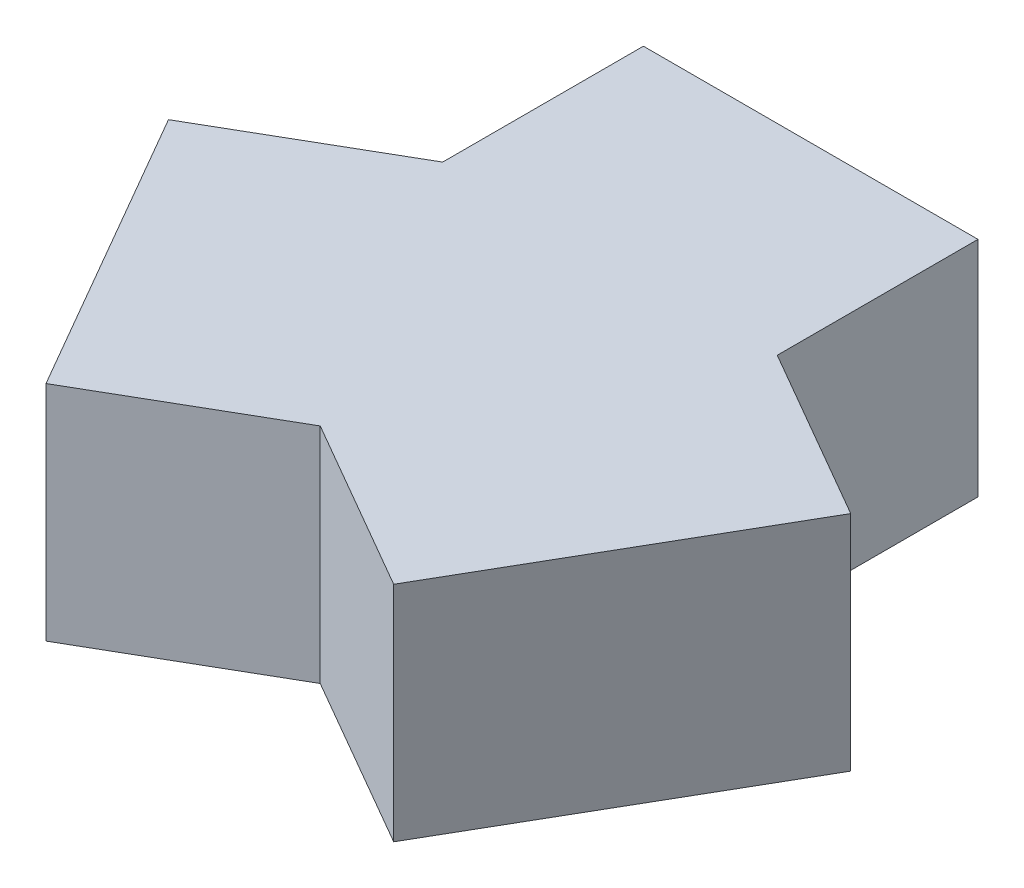
ISO-10303-21;
HEADER;
FILE_DESCRIPTION(('STEP AP214'),'2;1');
FILE_NAME('part.step','',(''),(''),'','','');
FILE_SCHEMA(('AUTOMOTIVE_DESIGN { 1 0 10303 214 1 1 1 1 }'));
ENDSEC;
DATA;
#1=APPLICATION_CONTEXT('core data for automotive mechanical design processes');
#2=APPLICATION_PROTOCOL_DEFINITION('international standard','automotive_design',2000,#1);
#3=PRODUCT_CONTEXT('',#1,'mechanical');
#4=PRODUCT('Part','Part','',(#3));
#5=PRODUCT_RELATED_PRODUCT_CATEGORY('part','',(#4));
#6=PRODUCT_DEFINITION_FORMATION('','',#4);
#7=PRODUCT_DEFINITION_CONTEXT('part definition',#1,'design');
#8=PRODUCT_DEFINITION('design','',#6,#7);
#9=PRODUCT_DEFINITION_SHAPE('','',#8);
#10=(LENGTH_UNIT() NAMED_UNIT(*) SI_UNIT(.MILLI.,.METRE.));
#11=(NAMED_UNIT(*) PLANE_ANGLE_UNIT() SI_UNIT($,.RADIAN.));
#12=(NAMED_UNIT(*) SI_UNIT($,.STERADIAN.) SOLID_ANGLE_UNIT());
#13=UNCERTAINTY_MEASURE_WITH_UNIT(LENGTH_MEASURE(1.E-05),#10,'distance_accuracy_value','');
#14=(GEOMETRIC_REPRESENTATION_CONTEXT(3) GLOBAL_UNCERTAINTY_ASSIGNED_CONTEXT((#13)) GLOBAL_UNIT_ASSIGNED_CONTEXT((#10,
#11,#12)) REPRESENTATION_CONTEXT('',''));
#15=CARTESIAN_POINT('',(0.,0.,0.));
#16=DIRECTION('',(0.,0.,1.));
#17=DIRECTION('',(1.,0.,0.));
#18=AXIS2_PLACEMENT_3D('',#15,#16,#17);
#19=CARTESIAN_POINT('',(7.50000000000006,5.,-5.));
#20=DIRECTION('',(-1.,0.,0.));
#21=DIRECTION('',(0.,0.,1.));
#22=AXIS2_PLACEMENT_3D('',#19,#20,#21);
#23=PLANE('',#22);
#24=DIRECTION('',(0.,0.,-1.));
#25=VECTOR('',#24,1.);
#26=CARTESIAN_POINT('',(7.50000000000006,-5.,-5.));
#27=LINE('',#26,#25);
#28=CARTESIAN_POINT('',(7.50000000000006,-5.,-5.));
#29=VERTEX_POINT('',#28);
#30=CARTESIAN_POINT('',(7.50000000000006,-5.,-14.));
#31=VERTEX_POINT('',#30);
#32=EDGE_CURVE('E146',#29,#31,#27,.T.);
#33=ORIENTED_EDGE('',*,*,#32,.T.);
#34=DIRECTION('',(0.,-1.,0.));
#35=VECTOR('',#34,1.);
#36=CARTESIAN_POINT('',(7.50000000000006,5.,-14.));
#37=LINE('',#36,#35);
#38=CARTESIAN_POINT('',(7.50000000000006,5.,-14.));
#39=VERTEX_POINT('',#38);
#40=EDGE_CURVE('E11',#39,#31,#37,.T.);
#41=ORIENTED_EDGE('',*,*,#40,.F.);
#42=DIRECTION('',(0.,0.,-1.));
#43=VECTOR('',#42,1.);
#44=CARTESIAN_POINT('',(7.50000000000006,5.,-5.));
#45=LINE('',#44,#43);
#46=CARTESIAN_POINT('',(7.50000000000006,5.,-5.));
#47=VERTEX_POINT('',#46);
#48=EDGE_CURVE('E171',#47,#39,#45,.T.);
#49=ORIENTED_EDGE('',*,*,#48,.F.);
#50=DIRECTION('',(0.,-1.,0.));
#51=VECTOR('',#50,1.);
#52=CARTESIAN_POINT('',(7.50000000000006,5.,-5.));
#53=LINE('',#52,#51);
#54=EDGE_CURVE('E142',#47,#29,#53,.T.);
#55=ORIENTED_EDGE('',*,*,#54,.T.);
#56=EDGE_LOOP('',(#33,#41,#49,#55));
#57=FACE_BOUND('',#56,.T.);
#58=ADVANCED_FACE('F39',(#57),#23,.F.);
#59=CARTESIAN_POINT('',(-7.50000000000006,5.,-14.));
#60=DIRECTION('',(0.,0.,1.));
#61=DIRECTION('',(1.,0.,0.));
#62=AXIS2_PLACEMENT_3D('',#59,#60,#61);
#63=PLANE('',#62);
#64=DIRECTION('',(-1.,0.,0.));
#65=VECTOR('',#64,1.);
#66=CARTESIAN_POINT('',(-7.50000000000006,-5.,-14.));
#67=LINE('',#66,#65);
#68=CARTESIAN_POINT('',(-7.50000000000006,-5.,-14.));
#69=VERTEX_POINT('',#68);
#70=EDGE_CURVE('E150',#31,#69,#67,.T.);
#71=ORIENTED_EDGE('',*,*,#70,.T.);
#72=DIRECTION('',(0.,-1.,0.));
#73=VECTOR('',#72,1.);
#74=CARTESIAN_POINT('',(-7.50000000000006,5.,-14.));
#75=LINE('',#74,#73);
#76=CARTESIAN_POINT('',(-7.50000000000006,5.,-14.));
#77=VERTEX_POINT('',#76);
#78=EDGE_CURVE('E48',#77,#69,#75,.T.);
#79=ORIENTED_EDGE('',*,*,#78,.F.);
#80=DIRECTION('',(-1.,0.,0.));
#81=VECTOR('',#80,1.);
#82=CARTESIAN_POINT('',(-7.50000000000006,5.,-14.));
#83=LINE('',#82,#81);
#84=EDGE_CURVE('E102',#39,#77,#83,.T.);
#85=ORIENTED_EDGE('',*,*,#84,.F.);
#86=ORIENTED_EDGE('',*,*,#40,.T.);
#87=EDGE_LOOP('',(#71,#79,#85,#86));
#88=FACE_BOUND('',#87,.T.);
#89=ADVANCED_FACE('F227',(#88),#63,.F.);
#90=CARTESIAN_POINT('',(-7.50000000000006,5.,-5.));
#91=DIRECTION('',(1.,0.,0.));
#92=DIRECTION('',(0.,0.,-1.));
#93=AXIS2_PLACEMENT_3D('',#90,#91,#92);
#94=PLANE('',#93);
#95=DIRECTION('',(0.,0.,1.));
#96=VECTOR('',#95,1.);
#97=CARTESIAN_POINT('',(-7.50000000000006,-5.,-5.));
#98=LINE('',#97,#96);
#99=CARTESIAN_POINT('',(-7.50000000000006,-5.,-5.));
#100=VERTEX_POINT('',#99);
#101=EDGE_CURVE('E153',#69,#100,#98,.T.);
#102=ORIENTED_EDGE('',*,*,#101,.T.);
#103=DIRECTION('',(0.,-1.,0.));
#104=VECTOR('',#103,1.);
#105=CARTESIAN_POINT('',(-7.50000000000006,5.,-5.));
#106=LINE('',#105,#104);
#107=CARTESIAN_POINT('',(-7.50000000000006,5.,-5.));
#108=VERTEX_POINT('',#107);
#109=EDGE_CURVE('E186',#108,#100,#106,.T.);
#110=ORIENTED_EDGE('',*,*,#109,.F.);
#111=DIRECTION('',(0.,0.,1.));
#112=VECTOR('',#111,1.);
#113=CARTESIAN_POINT('',(-7.50000000000006,5.,-5.));
#114=LINE('',#113,#112);
#115=EDGE_CURVE('E196',#77,#108,#114,.T.);
#116=ORIENTED_EDGE('',*,*,#115,.F.);
#117=ORIENTED_EDGE('',*,*,#78,.T.);
#118=EDGE_LOOP('',(#102,#110,#116,#117));
#119=FACE_BOUND('',#118,.T.);
#120=ADVANCED_FACE('F194',(#119),#94,.F.);
#121=CARTESIAN_POINT('',(-15.29422863406,5.,-0.499999999999995));
#122=DIRECTION('',(0.5,0.,0.866025403784438));
#123=DIRECTION('',(0.866025403784438,0.,-0.5));
#124=AXIS2_PLACEMENT_3D('',#121,#122,#123);
#125=PLANE('',#124);
#126=DIRECTION('',(-0.866025403784438,0.,0.5));
#127=VECTOR('',#126,1.);
#128=CARTESIAN_POINT('',(-15.29422863406,-5.,-0.499999999999995));
#129=LINE('',#128,#127);
#130=CARTESIAN_POINT('',(-15.29422863406,-5.,-0.499999999999995));
#131=VERTEX_POINT('',#130);
#132=EDGE_CURVE('E156',#100,#131,#129,.T.);
#133=ORIENTED_EDGE('',*,*,#132,.T.);
#134=DIRECTION('',(0.,-1.,0.));
#135=VECTOR('',#134,1.);
#136=CARTESIAN_POINT('',(-15.29422863406,5.,-0.499999999999995));
#137=LINE('',#136,#135);
#138=CARTESIAN_POINT('',(-15.29422863406,5.,-0.499999999999995));
#139=VERTEX_POINT('',#138);
#140=EDGE_CURVE('E182',#139,#131,#137,.T.);
#141=ORIENTED_EDGE('',*,*,#140,.F.);
#142=DIRECTION('',(-0.866025403784438,0.,0.5));
#143=VECTOR('',#142,1.);
#144=CARTESIAN_POINT('',(-15.29422863406,5.,-0.499999999999995));
#145=LINE('',#144,#143);
#146=EDGE_CURVE('E213',#108,#139,#145,.T.);
#147=ORIENTED_EDGE('',*,*,#146,.F.);
#148=ORIENTED_EDGE('',*,*,#109,.T.);
#149=EDGE_LOOP('',(#133,#141,#147,#148));
#150=FACE_BOUND('',#149,.T.);
#151=ADVANCED_FACE('F205',(#150),#125,.F.);
#152=CARTESIAN_POINT('',(-15.29422863406,5.,-0.499999999999995));
#153=DIRECTION('',(0.866025403784438,0.,-0.5));
#154=DIRECTION('',(-0.5,0.,-0.866025403784439));
#155=AXIS2_PLACEMENT_3D('',#152,#153,#154);
#156=PLANE('',#155);
#157=DIRECTION('',(0.5,0.,0.866025403784438));
#158=VECTOR('',#157,1.);
#159=CARTESIAN_POINT('',(-15.29422863406,-5.,-0.499999999999995));
#160=LINE('',#159,#158);
#161=CARTESIAN_POINT('',(-7.79422863405994,-5.,12.4903810567667));
#162=VERTEX_POINT('',#161);
#163=EDGE_CURVE('E159',#131,#162,#160,.T.);
#164=ORIENTED_EDGE('',*,*,#163,.T.);
#165=DIRECTION('',(0.,-1.,0.));
#166=VECTOR('',#165,1.);
#167=CARTESIAN_POINT('',(-7.79422863405994,5.,12.4903810567667));
#168=LINE('',#167,#166);
#169=CARTESIAN_POINT('',(-7.79422863405994,5.,12.4903810567667));
#170=VERTEX_POINT('',#169);
#171=EDGE_CURVE('E178',#170,#162,#168,.T.);
#172=ORIENTED_EDGE('',*,*,#171,.F.);
#173=DIRECTION('',(0.5,0.,0.866025403784438));
#174=VECTOR('',#173,1.);
#175=CARTESIAN_POINT('',(-15.29422863406,5.,-0.499999999999995));
#176=LINE('',#175,#174);
#177=EDGE_CURVE('E211',#139,#170,#176,.T.);
#178=ORIENTED_EDGE('',*,*,#177,.F.);
#179=ORIENTED_EDGE('',*,*,#140,.T.);
#180=EDGE_LOOP('',(#164,#172,#178,#179));
#181=FACE_BOUND('',#180,.T.);
#182=ADVANCED_FACE('F209',(#181),#156,.F.);
#183=CARTESIAN_POINT('',(0.,5.,7.99038105676669));
#184=DIRECTION('',(-0.5,0.,-0.866025403784438));
#185=DIRECTION('',(-0.866025403784439,0.,0.5));
#186=AXIS2_PLACEMENT_3D('',#183,#184,#185);
#187=PLANE('',#186);
#188=DIRECTION('',(0.866025403784439,0.,-0.5));
#189=VECTOR('',#188,1.);
#190=CARTESIAN_POINT('',(0.,-5.,7.99038105676669));
#191=LINE('',#190,#189);
#192=CARTESIAN_POINT('',(0.,-5.,7.99038105676669));
#193=VERTEX_POINT('',#192);
#194=EDGE_CURVE('E162',#162,#193,#191,.T.);
#195=ORIENTED_EDGE('',*,*,#194,.T.);
#196=DIRECTION('',(0.,-1.,0.));
#197=VECTOR('',#196,1.);
#198=CARTESIAN_POINT('',(0.,5.,7.99038105676669));
#199=LINE('',#198,#197);
#200=CARTESIAN_POINT('',(0.,5.,7.99038105676669));
#201=VERTEX_POINT('',#200);
#202=EDGE_CURVE('E135',#201,#193,#199,.T.);
#203=ORIENTED_EDGE('',*,*,#202,.F.);
#204=DIRECTION('',(0.866025403784439,0.,-0.5));
#205=VECTOR('',#204,1.);
#206=CARTESIAN_POINT('',(0.,5.,7.99038105676669));
#207=LINE('',#206,#205);
#208=EDGE_CURVE('E124',#170,#201,#207,.T.);
#209=ORIENTED_EDGE('',*,*,#208,.F.);
#210=ORIENTED_EDGE('',*,*,#171,.T.);
#211=EDGE_LOOP('',(#195,#203,#209,#210));
#212=FACE_BOUND('',#211,.T.);
#213=ADVANCED_FACE('F239',(#212),#187,.F.);
#214=CARTESIAN_POINT('',(0.,5.,7.99038105676669));
#215=DIRECTION('',(0.5,0.,-0.866025403784439));
#216=DIRECTION('',(-0.866025403784439,0.,-0.5));
#217=AXIS2_PLACEMENT_3D('',#214,#215,#216);
#218=PLANE('',#217);
#219=DIRECTION('',(0.866025403784439,0.,0.499999999999999));
#220=VECTOR('',#219,1.);
#221=CARTESIAN_POINT('',(0.,-5.,7.99038105676669));
#222=LINE('',#221,#220);
#223=CARTESIAN_POINT('',(7.79422863405995,-5.,12.4903810567667));
#224=VERTEX_POINT('',#223);
#225=EDGE_CURVE('E133',#193,#224,#222,.T.);
#226=ORIENTED_EDGE('',*,*,#225,.T.);
#227=DIRECTION('',(0.,-1.,0.));
#228=VECTOR('',#227,1.);
#229=CARTESIAN_POINT('',(7.79422863405995,5.,12.4903810567667));
#230=LINE('',#229,#228);
#231=CARTESIAN_POINT('',(7.79422863405995,5.,12.4903810567667));
#232=VERTEX_POINT('',#231);
#233=EDGE_CURVE('E130',#232,#224,#230,.T.);
#234=ORIENTED_EDGE('',*,*,#233,.F.);
#235=DIRECTION('',(0.866025403784439,0.,0.499999999999999));
#236=VECTOR('',#235,1.);
#237=CARTESIAN_POINT('',(0.,5.,7.99038105676669));
#238=LINE('',#237,#236);
#239=EDGE_CURVE('E118',#201,#232,#238,.T.);
#240=ORIENTED_EDGE('',*,*,#239,.F.);
#241=ORIENTED_EDGE('',*,*,#202,.T.);
#242=EDGE_LOOP('',(#226,#234,#240,#241));
#243=FACE_BOUND('',#242,.T.);
#244=ADVANCED_FACE('F131',(#243),#218,.F.);
#245=CARTESIAN_POINT('',(15.29422863406,5.,-0.499999999999999));
#246=DIRECTION('',(-0.866025403784439,0.,-0.5));
#247=DIRECTION('',(-0.5,0.,0.866025403784439));
#248=AXIS2_PLACEMENT_3D('',#245,#246,#247);
#249=PLANE('',#248);
#250=DIRECTION('',(0.5,0.,-0.866025403784439));
#251=VECTOR('',#250,1.);
#252=CARTESIAN_POINT('',(15.29422863406,-5.,-0.499999999999999));
#253=LINE('',#252,#251);
#254=CARTESIAN_POINT('',(15.29422863406,-5.,-0.499999999999999));
#255=VERTEX_POINT('',#254);
#256=EDGE_CURVE('E88',#224,#255,#253,.T.);
#257=ORIENTED_EDGE('',*,*,#256,.T.);
#258=DIRECTION('',(0.,-1.,0.));
#259=VECTOR('',#258,1.);
#260=CARTESIAN_POINT('',(15.29422863406,5.,-0.499999999999999));
#261=LINE('',#260,#259);
#262=CARTESIAN_POINT('',(15.29422863406,5.,-0.499999999999999));
#263=VERTEX_POINT('',#262);
#264=EDGE_CURVE('E136',#263,#255,#261,.T.);
#265=ORIENTED_EDGE('',*,*,#264,.F.);
#266=DIRECTION('',(0.5,0.,-0.866025403784439));
#267=VECTOR('',#266,1.);
#268=CARTESIAN_POINT('',(15.29422863406,5.,-0.499999999999999));
#269=LINE('',#268,#267);
#270=EDGE_CURVE('E122',#232,#263,#269,.T.);
#271=ORIENTED_EDGE('',*,*,#270,.F.);
#272=ORIENTED_EDGE('',*,*,#233,.T.);
#273=EDGE_LOOP('',(#257,#265,#271,#272));
#274=FACE_BOUND('',#273,.T.);
#275=ADVANCED_FACE('F138',(#274),#249,.F.);
#276=CARTESIAN_POINT('',(15.29422863406,5.,-0.499999999999999));
#277=DIRECTION('',(-0.5,0.,0.866025403784439));
#278=DIRECTION('',(0.866025403784439,0.,0.5));
#279=AXIS2_PLACEMENT_3D('',#276,#277,#278);
#280=PLANE('',#279);
#281=DIRECTION('',(-0.866025403784439,0.,-0.5));
#282=VECTOR('',#281,1.);
#283=CARTESIAN_POINT('',(15.29422863406,-5.,-0.499999999999999));
#284=LINE('',#283,#282);
#285=EDGE_CURVE('E94',#255,#29,#284,.T.);
#286=ORIENTED_EDGE('',*,*,#285,.T.);
#287=ORIENTED_EDGE('',*,*,#54,.F.);
#288=DIRECTION('',(-0.866025403784439,0.,-0.5));
#289=VECTOR('',#288,1.);
#290=CARTESIAN_POINT('',(15.29422863406,5.,-0.499999999999999));
#291=LINE('',#290,#289);
#292=EDGE_CURVE('E56',#263,#47,#291,.T.);
#293=ORIENTED_EDGE('',*,*,#292,.F.);
#294=ORIENTED_EDGE('',*,*,#264,.T.);
#295=EDGE_LOOP('',(#286,#287,#293,#294));
#296=FACE_BOUND('',#295,.T.);
#297=ADVANCED_FACE('F247',(#296),#280,.F.);
#298=CARTESIAN_POINT('',(0.,5.,0.));
#299=DIRECTION('',(0.,-1.,0.));
#300=DIRECTION('',(0.,0.,-1.));
#301=AXIS2_PLACEMENT_3D('',#298,#299,#300);
#302=PLANE('',#301);
#303=ORIENTED_EDGE('',*,*,#48,.T.);
#304=ORIENTED_EDGE('',*,*,#84,.T.);
#305=ORIENTED_EDGE('',*,*,#115,.T.);
#306=ORIENTED_EDGE('',*,*,#146,.T.);
#307=ORIENTED_EDGE('',*,*,#177,.T.);
#308=ORIENTED_EDGE('',*,*,#208,.T.);
#309=ORIENTED_EDGE('',*,*,#239,.T.);
#310=ORIENTED_EDGE('',*,*,#270,.T.);
#311=ORIENTED_EDGE('',*,*,#292,.T.);
#312=EDGE_LOOP('',(#303,#304,#305,#306,#307,#308,#309,#310,#311));
#313=FACE_BOUND('',#312,.T.);
#314=ADVANCED_FACE('F120',(#313),#302,.F.);
#315=CARTESIAN_POINT('',(0.,-5.,0.));
#316=DIRECTION('',(0.,-1.,0.));
#317=DIRECTION('',(0.,0.,-1.));
#318=AXIS2_PLACEMENT_3D('',#315,#316,#317);
#319=PLANE('',#318);
#320=ORIENTED_EDGE('',*,*,#32,.F.);
#321=ORIENTED_EDGE('',*,*,#285,.F.);
#322=ORIENTED_EDGE('',*,*,#256,.F.);
#323=ORIENTED_EDGE('',*,*,#225,.F.);
#324=ORIENTED_EDGE('',*,*,#194,.F.);
#325=ORIENTED_EDGE('',*,*,#163,.F.);
#326=ORIENTED_EDGE('',*,*,#132,.F.);
#327=ORIENTED_EDGE('',*,*,#101,.F.);
#328=ORIENTED_EDGE('',*,*,#70,.F.);
#329=EDGE_LOOP('',(#320,#321,#322,#323,#324,#325,#326,#327,#328));
#330=FACE_BOUND('',#329,.T.);
#331=ADVANCED_FACE('F200',(#330),#319,.T.);
#332=CLOSED_SHELL('',(#58,#89,#120,#151,#182,#213,#244,#275,#297,#314,#331));
#333=MANIFOLD_SOLID_BREP('B2',#332);
#334=ADVANCED_BREP_SHAPE_REPRESENTATION('',(#18,#333),#14);
#335=SHAPE_DEFINITION_REPRESENTATION(#9,#334);
ENDSEC;
END-ISO-10303-21;
